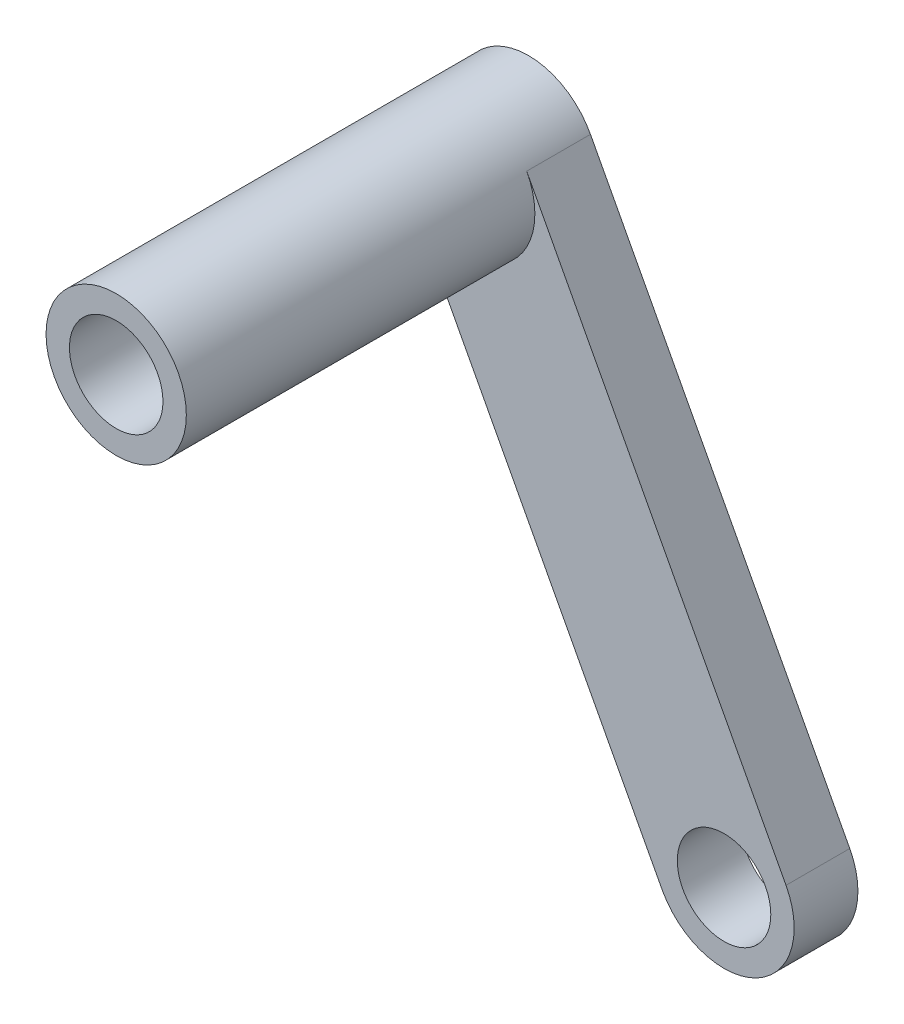
ISO-10303-21;
HEADER;
FILE_DESCRIPTION(('STEP AP214'),'2;1');
FILE_NAME('part.step','',(''),(''),'','','');
FILE_SCHEMA(('AUTOMOTIVE_DESIGN { 1 0 10303 214 1 1 1 1 }'));
ENDSEC;
DATA;
#1=APPLICATION_CONTEXT('core data for automotive mechanical design processes');
#2=APPLICATION_PROTOCOL_DEFINITION('international standard','automotive_design',2000,#1);
#3=PRODUCT_CONTEXT('',#1,'mechanical');
#4=PRODUCT('Part','Part','',(#3));
#5=PRODUCT_RELATED_PRODUCT_CATEGORY('part','',(#4));
#6=PRODUCT_DEFINITION_FORMATION('','',#4);
#7=PRODUCT_DEFINITION_CONTEXT('part definition',#1,'design');
#8=PRODUCT_DEFINITION('design','',#6,#7);
#9=PRODUCT_DEFINITION_SHAPE('','',#8);
#10=(LENGTH_UNIT() NAMED_UNIT(*) SI_UNIT(.MILLI.,.METRE.));
#11=(NAMED_UNIT(*) PLANE_ANGLE_UNIT() SI_UNIT($,.RADIAN.));
#12=(NAMED_UNIT(*) SI_UNIT($,.STERADIAN.) SOLID_ANGLE_UNIT());
#13=UNCERTAINTY_MEASURE_WITH_UNIT(LENGTH_MEASURE(1.E-05),#10,'distance_accuracy_value','');
#14=(GEOMETRIC_REPRESENTATION_CONTEXT(3) GLOBAL_UNCERTAINTY_ASSIGNED_CONTEXT((#13)) GLOBAL_UNIT_ASSIGNED_CONTEXT((#10,
#11,#12)) REPRESENTATION_CONTEXT('',''));
#15=CARTESIAN_POINT('',(0.,0.,0.));
#16=DIRECTION('',(0.,0.,1.));
#17=DIRECTION('',(1.,0.,0.));
#18=AXIS2_PLACEMENT_3D('',#15,#16,#17);
#19=CARTESIAN_POINT('',(-23.9377049180328,-5.80983606557376,3.));
#20=DIRECTION('',(0.,0.,1.));
#21=DIRECTION('',(1.,0.,0.));
#22=AXIS2_PLACEMENT_3D('',#19,#20,#21);
#23=PLANE('',#22);
#24=CARTESIAN_POINT('',(-36.1377049180329,17.1901639344262,3.));
#25=DIRECTION('',(0.,0.,1.));
#26=DIRECTION('',(1.,0.,0.));
#27=AXIS2_PLACEMENT_3D('',#24,#25,#26);
#28=CIRCLE('',#27,3.3);
#29=CARTESIAN_POINT('',(-39.05297086169,15.6438054773559,3.));
#30=VERTEX_POINT('',#29);
#31=CARTESIAN_POINT('',(-33.2224389743757,18.7365223914965,3.));
#32=VERTEX_POINT('',#31);
#33=EDGE_CURVE('E11',#30,#32,#28,.T.);
#34=ORIENTED_EDGE('',*,*,#33,.F.);
#35=DIRECTION('',(0.468593471839489,-0.883413922320344,0.));
#36=VECTOR('',#35,1.);
#37=CARTESIAN_POINT('',(-26.8529708616899,-7.35619452264408,3.));
#38=LINE('',#37,#36);
#39=CARTESIAN_POINT('',(-26.8529708616899,-7.35619452264408,3.));
#40=VERTEX_POINT('',#39);
#41=EDGE_CURVE('E60',#30,#40,#38,.T.);
#42=ORIENTED_EDGE('',*,*,#41,.T.);
#43=CARTESIAN_POINT('',(-23.9377049180328,-5.80983606557376,3.));
#44=DIRECTION('',(0.,0.,1.));
#45=DIRECTION('',(1.,0.,0.));
#46=AXIS2_PLACEMENT_3D('',#43,#44,#45);
#47=CIRCLE('',#46,3.3);
#48=CARTESIAN_POINT('',(-21.0224389743757,-4.26347760850345,3.));
#49=VERTEX_POINT('',#48);
#50=EDGE_CURVE('E99',#40,#49,#47,.T.);
#51=ORIENTED_EDGE('',*,*,#50,.T.);
#52=DIRECTION('',(-0.468593471839489,0.883413922320344,0.));
#53=VECTOR('',#52,1.);
#54=CARTESIAN_POINT('',(-21.0224389743757,-4.26347760850345,3.));
#55=LINE('',#54,#53);
#56=EDGE_CURVE('E90',#49,#32,#55,.T.);
#57=ORIENTED_EDGE('',*,*,#56,.T.);
#58=EDGE_LOOP('',(#34,#42,#51,#57));
#59=FACE_BOUND('',#58,.T.);
#60=CARTESIAN_POINT('',(-23.9377049180328,-5.80983606557376,3.));
#61=DIRECTION('',(0.,0.,1.));
#62=DIRECTION('',(1.,0.,0.));
#63=AXIS2_PLACEMENT_3D('',#60,#61,#62);
#64=CIRCLE('',#63,2.2);
#65=CARTESIAN_POINT('',(-21.7377049180328,-5.80983606557376,3.));
#66=VERTEX_POINT('',#65);
#67=EDGE_CURVE('E119',#66,#66,#64,.T.);
#68=ORIENTED_EDGE('',*,*,#67,.F.);
#69=EDGE_LOOP('',(#68));
#70=FACE_BOUND('',#69,.T.);
#71=ADVANCED_FACE('F41',(#59,#70),#23,.T.);
#72=CARTESIAN_POINT('',(-23.9377049180328,-5.80983606557376,0.));
#73=DIRECTION('',(0.,0.,1.));
#74=DIRECTION('',(1.,0.,0.));
#75=AXIS2_PLACEMENT_3D('',#72,#73,#74);
#76=PLANE('',#75);
#77=CARTESIAN_POINT('',(-23.9377049180328,-5.80983606557376,0.));
#78=DIRECTION('',(0.,0.,1.));
#79=DIRECTION('',(1.,0.,0.));
#80=AXIS2_PLACEMENT_3D('',#77,#78,#79);
#81=CIRCLE('',#80,3.3);
#82=CARTESIAN_POINT('',(-26.8529708616899,-7.35619452264408,0.));
#83=VERTEX_POINT('',#82);
#84=CARTESIAN_POINT('',(-21.0224389743757,-4.26347760850345,0.));
#85=VERTEX_POINT('',#84);
#86=EDGE_CURVE('E115',#83,#85,#81,.T.);
#87=ORIENTED_EDGE('',*,*,#86,.F.);
#88=DIRECTION('',(0.468593471839489,-0.883413922320344,0.));
#89=VECTOR('',#88,1.);
#90=CARTESIAN_POINT('',(-26.8529708616899,-7.35619452264408,0.));
#91=LINE('',#90,#89);
#92=CARTESIAN_POINT('',(-39.05297086169,15.6438054773559,0.));
#93=VERTEX_POINT('',#92);
#94=EDGE_CURVE('E83',#93,#83,#91,.T.);
#95=ORIENTED_EDGE('',*,*,#94,.F.);
#96=CARTESIAN_POINT('',(-36.1377049180329,17.1901639344262,0.));
#97=DIRECTION('',(0.,0.,1.));
#98=DIRECTION('',(1.,0.,0.));
#99=AXIS2_PLACEMENT_3D('',#96,#97,#98);
#100=CIRCLE('',#99,3.3);
#101=CARTESIAN_POINT('',(-33.2224389743757,18.7365223914965,0.));
#102=VERTEX_POINT('',#101);
#103=EDGE_CURVE('E78',#102,#93,#100,.T.);
#104=ORIENTED_EDGE('',*,*,#103,.F.);
#105=DIRECTION('',(-0.468593471839489,0.883413922320344,0.));
#106=VECTOR('',#105,1.);
#107=CARTESIAN_POINT('',(-21.0224389743757,-4.26347760850345,0.));
#108=LINE('',#107,#106);
#109=EDGE_CURVE('E94',#85,#102,#108,.T.);
#110=ORIENTED_EDGE('',*,*,#109,.F.);
#111=EDGE_LOOP('',(#87,#95,#104,#110));
#112=FACE_BOUND('',#111,.T.);
#113=CARTESIAN_POINT('',(-23.9377049180328,-5.80983606557376,0.));
#114=DIRECTION('',(0.,0.,1.));
#115=DIRECTION('',(1.,0.,0.));
#116=AXIS2_PLACEMENT_3D('',#113,#114,#115);
#117=CIRCLE('',#116,2.2);
#118=CARTESIAN_POINT('',(-21.7377049180328,-5.80983606557376,0.));
#119=VERTEX_POINT('',#118);
#120=EDGE_CURVE('E127',#119,#119,#117,.T.);
#121=ORIENTED_EDGE('',*,*,#120,.T.);
#122=EDGE_LOOP('',(#121));
#123=FACE_BOUND('',#122,.T.);
#124=CARTESIAN_POINT('',(-36.1377049180329,17.1901639344262,0.));
#125=DIRECTION('',(0.,0.,1.));
#126=DIRECTION('',(1.,0.,0.));
#127=AXIS2_PLACEMENT_3D('',#124,#125,#126);
#128=CIRCLE('',#127,2.2);
#129=CARTESIAN_POINT('',(-33.9377049180328,17.1901639344262,0.));
#130=VERTEX_POINT('',#129);
#131=EDGE_CURVE('E131',#130,#130,#128,.T.);
#132=ORIENTED_EDGE('',*,*,#131,.T.);
#133=EDGE_LOOP('',(#132));
#134=FACE_BOUND('',#133,.T.);
#135=ADVANCED_FACE('F160',(#112,#123,#134),#76,.F.);
#136=CARTESIAN_POINT('',(-23.9377049180328,-5.80983606557376,3.));
#137=DIRECTION('',(0.,0.,-1.));
#138=DIRECTION('',(-1.,0.,0.));
#139=AXIS2_PLACEMENT_3D('',#136,#137,#138);
#140=CYLINDRICAL_SURFACE('',#139,3.3);
#141=ORIENTED_EDGE('',*,*,#86,.T.);
#142=DIRECTION('',(0.,0.,-1.));
#143=VECTOR('',#142,1.);
#144=CARTESIAN_POINT('',(-21.0224389743757,-4.26347760850345,3.));
#145=LINE('',#144,#143);
#146=EDGE_CURVE('E45',#49,#85,#145,.T.);
#147=ORIENTED_EDGE('',*,*,#146,.F.);
#148=ORIENTED_EDGE('',*,*,#50,.F.);
#149=DIRECTION('',(0.,0.,-1.));
#150=VECTOR('',#149,1.);
#151=CARTESIAN_POINT('',(-26.8529708616899,-7.35619452264408,3.));
#152=LINE('',#151,#150);
#153=EDGE_CURVE('E106',#40,#83,#152,.T.);
#154=ORIENTED_EDGE('',*,*,#153,.T.);
#155=EDGE_LOOP('',(#141,#147,#148,#154));
#156=FACE_BOUND('',#155,.T.);
#157=ADVANCED_FACE('F43',(#156),#140,.T.);
#158=CARTESIAN_POINT('',(-21.0224389743757,-4.26347760850345,3.));
#159=DIRECTION('',(-0.883413922320344,-0.468593471839489,0.));
#160=DIRECTION('',(0.468593471839489,-0.883413922320344,0.));
#161=AXIS2_PLACEMENT_3D('',#158,#159,#160);
#162=PLANE('',#161);
#163=ORIENTED_EDGE('',*,*,#109,.T.);
#164=DIRECTION('',(0.,0.,-1.));
#165=VECTOR('',#164,1.);
#166=CARTESIAN_POINT('',(-33.2224389743757,18.7365223914965,3.));
#167=LINE('',#166,#165);
#168=EDGE_CURVE('E92',#32,#102,#167,.T.);
#169=ORIENTED_EDGE('',*,*,#168,.F.);
#170=ORIENTED_EDGE('',*,*,#56,.F.);
#171=ORIENTED_EDGE('',*,*,#146,.T.);
#172=EDGE_LOOP('',(#163,#169,#170,#171));
#173=FACE_BOUND('',#172,.T.);
#174=ADVANCED_FACE('F93',(#173),#162,.F.);
#175=CARTESIAN_POINT('',(-36.1377049180329,17.1901639344262,3.));
#176=DIRECTION('',(0.,0.,-1.));
#177=DIRECTION('',(-1.,0.,0.));
#178=AXIS2_PLACEMENT_3D('',#175,#176,#177);
#179=CYLINDRICAL_SURFACE('',#178,3.3);
#180=ORIENTED_EDGE('',*,*,#103,.T.);
#181=DIRECTION('',(0.,0.,-1.));
#182=VECTOR('',#181,1.);
#183=CARTESIAN_POINT('',(-39.05297086169,15.6438054773559,3.));
#184=LINE('',#183,#182);
#185=EDGE_CURVE('E96',#30,#93,#184,.T.);
#186=ORIENTED_EDGE('',*,*,#185,.F.);
#187=ORIENTED_EDGE('',*,*,#33,.T.);
#188=ORIENTED_EDGE('',*,*,#168,.T.);
#189=EDGE_LOOP('',(#180,#186,#187,#188));
#190=FACE_BOUND('',#189,.T.);
#191=CARTESIAN_POINT('',(-36.1377049180329,17.1901639344262,19.4));
#192=DIRECTION('',(0.,0.,1.));
#193=DIRECTION('',(1.,0.,0.));
#194=AXIS2_PLACEMENT_3D('',#191,#192,#193);
#195=CIRCLE('',#194,3.3);
#196=CARTESIAN_POINT('',(-32.8377049180329,17.1901639344262,19.4));
#197=VERTEX_POINT('',#196);
#198=EDGE_CURVE('E137',#197,#197,#195,.T.);
#199=ORIENTED_EDGE('',*,*,#198,.F.);
#200=EDGE_LOOP('',(#199));
#201=FACE_BOUND('',#200,.T.);
#202=ADVANCED_FACE('F103',(#190,#201),#179,.T.);
#203=CARTESIAN_POINT('',(-26.8529708616899,-7.35619452264408,3.));
#204=DIRECTION('',(0.883413922320344,0.468593471839489,0.));
#205=DIRECTION('',(-0.468593471839489,0.883413922320344,0.));
#206=AXIS2_PLACEMENT_3D('',#203,#204,#205);
#207=PLANE('',#206);
#208=ORIENTED_EDGE('',*,*,#94,.T.);
#209=ORIENTED_EDGE('',*,*,#153,.F.);
#210=ORIENTED_EDGE('',*,*,#41,.F.);
#211=ORIENTED_EDGE('',*,*,#185,.T.);
#212=EDGE_LOOP('',(#208,#209,#210,#211));
#213=FACE_BOUND('',#212,.T.);
#214=ADVANCED_FACE('F108',(#213),#207,.F.);
#215=CARTESIAN_POINT('',(-23.9377049180328,-5.80983606557376,3.));
#216=DIRECTION('',(0.,0.,-1.));
#217=DIRECTION('',(-1.,0.,0.));
#218=AXIS2_PLACEMENT_3D('',#215,#216,#217);
#219=CYLINDRICAL_SURFACE('',#218,2.2);
#220=ORIENTED_EDGE('',*,*,#67,.T.);
#221=EDGE_LOOP('',(#220));
#222=FACE_BOUND('',#221,.T.);
#223=ORIENTED_EDGE('',*,*,#120,.F.);
#224=EDGE_LOOP('',(#223));
#225=FACE_BOUND('',#224,.T.);
#226=ADVANCED_FACE('F156',(#222,#225),#219,.F.);
#227=CARTESIAN_POINT('',(-36.1377049180329,17.1901639344262,3.));
#228=DIRECTION('',(0.,0.,-1.));
#229=DIRECTION('',(-1.,0.,0.));
#230=AXIS2_PLACEMENT_3D('',#227,#228,#229);
#231=CYLINDRICAL_SURFACE('',#230,2.2);
#232=ORIENTED_EDGE('',*,*,#131,.F.);
#233=EDGE_LOOP('',(#232));
#234=FACE_BOUND('',#233,.T.);
#235=CARTESIAN_POINT('',(-36.1377049180329,17.1901639344262,19.4));
#236=DIRECTION('',(0.,0.,1.));
#237=DIRECTION('',(1.,0.,0.));
#238=AXIS2_PLACEMENT_3D('',#235,#236,#237);
#239=CIRCLE('',#238,2.20000000000001);
#240=CARTESIAN_POINT('',(-33.9377049180328,17.1901639344262,19.4));
#241=VERTEX_POINT('',#240);
#242=EDGE_CURVE('E142',#241,#241,#239,.T.);
#243=ORIENTED_EDGE('',*,*,#242,.T.);
#244=EDGE_LOOP('',(#243));
#245=FACE_BOUND('',#244,.T.);
#246=ADVANCED_FACE('F147',(#234,#245),#231,.F.);
#247=CARTESIAN_POINT('',(-36.1377049180329,17.1901639344262,19.4));
#248=DIRECTION('',(0.,0.,1.));
#249=DIRECTION('',(1.,0.,0.));
#250=AXIS2_PLACEMENT_3D('',#247,#248,#249);
#251=PLANE('',#250);
#252=ORIENTED_EDGE('',*,*,#198,.T.);
#253=EDGE_LOOP('',(#252));
#254=FACE_BOUND('',#253,.T.);
#255=ORIENTED_EDGE('',*,*,#242,.F.);
#256=EDGE_LOOP('',(#255));
#257=FACE_BOUND('',#256,.T.);
#258=ADVANCED_FACE('F149',(#254,#257),#251,.T.);
#259=CLOSED_SHELL('',(#71,#135,#157,#174,#202,#214,#226,#246,#258));
#260=MANIFOLD_SOLID_BREP('B2',#259);
#261=ADVANCED_BREP_SHAPE_REPRESENTATION('',(#18,#260),#14);
#262=SHAPE_DEFINITION_REPRESENTATION(#9,#261);
ENDSEC;
END-ISO-10303-21;
